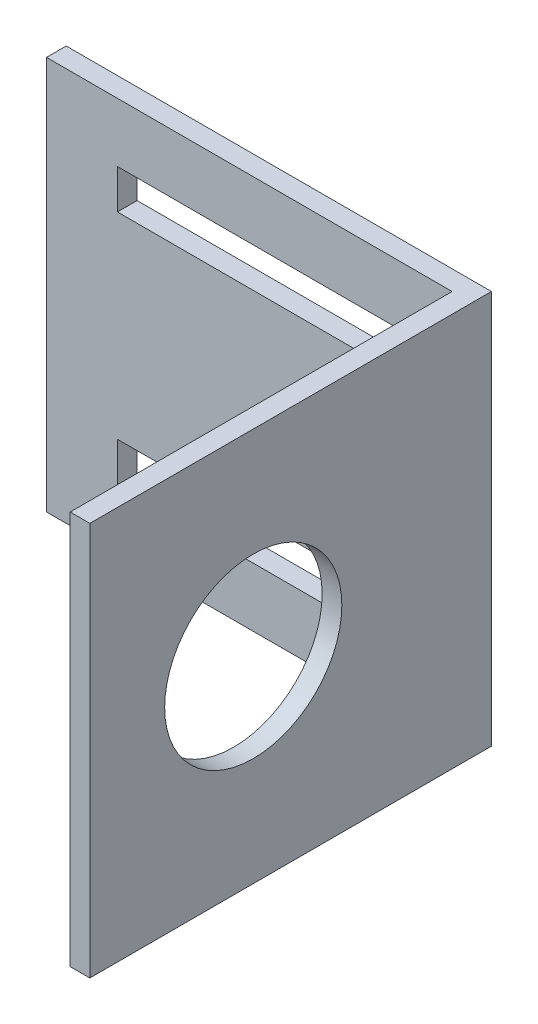
ISO-10303-21;
HEADER;
FILE_DESCRIPTION(('STEP AP214'),'2;1');
FILE_NAME('part.step','',(''),(''),'','','');
FILE_SCHEMA(('AUTOMOTIVE_DESIGN { 1 0 10303 214 1 1 1 1 }'));
ENDSEC;
DATA;
#1=APPLICATION_CONTEXT('core data for automotive mechanical design processes');
#2=APPLICATION_PROTOCOL_DEFINITION('international standard','automotive_design',2000,#1);
#3=PRODUCT_CONTEXT('',#1,'mechanical');
#4=PRODUCT('Part','Part','',(#3));
#5=PRODUCT_RELATED_PRODUCT_CATEGORY('part','',(#4));
#6=PRODUCT_DEFINITION_FORMATION('','',#4);
#7=PRODUCT_DEFINITION_CONTEXT('part definition',#1,'design');
#8=PRODUCT_DEFINITION('design','',#6,#7);
#9=PRODUCT_DEFINITION_SHAPE('','',#8);
#10=(LENGTH_UNIT() NAMED_UNIT(*) SI_UNIT(.MILLI.,.METRE.));
#11=(NAMED_UNIT(*) PLANE_ANGLE_UNIT() SI_UNIT($,.RADIAN.));
#12=(NAMED_UNIT(*) SI_UNIT($,.STERADIAN.) SOLID_ANGLE_UNIT());
#13=UNCERTAINTY_MEASURE_WITH_UNIT(LENGTH_MEASURE(1.E-05),#10,'distance_accuracy_value','');
#14=(GEOMETRIC_REPRESENTATION_CONTEXT(3) GLOBAL_UNCERTAINTY_ASSIGNED_CONTEXT((#13)) GLOBAL_UNIT_ASSIGNED_CONTEXT((#10,
#11,#12)) REPRESENTATION_CONTEXT('',''));
#15=CARTESIAN_POINT('',(0.,0.,0.));
#16=DIRECTION('',(0.,0.,1.));
#17=DIRECTION('',(1.,0.,0.));
#18=AXIS2_PLACEMENT_3D('',#15,#16,#17);
#19=CARTESIAN_POINT('',(0.,0.,2.5));
#20=DIRECTION('',(0.,0.,-1.));
#21=DIRECTION('',(-1.,0.,0.));
#22=AXIS2_PLACEMENT_3D('',#19,#20,#21);
#23=PLANE('',#22);
#24=DIRECTION('',(1.,0.,0.));
#25=VECTOR('',#24,1.);
#26=CARTESIAN_POINT('',(0.,-17.5,2.5));
#27=LINE('',#26,#25);
#28=CARTESIAN_POINT('',(-18.,-17.5,2.5));
#29=VERTEX_POINT('',#28);
#30=CARTESIAN_POINT('',(17.,-17.5,2.5));
#31=VERTEX_POINT('',#30);
#32=EDGE_CURVE('E192',#29,#31,#27,.T.);
#33=ORIENTED_EDGE('',*,*,#32,.F.);
#34=DIRECTION('',(0.,-1.,0.));
#35=VECTOR('',#34,1.);
#36=CARTESIAN_POINT('',(-18.,0.,2.5));
#37=LINE('',#36,#35);
#38=CARTESIAN_POINT('',(-18.,-12.5,2.5));
#39=VERTEX_POINT('',#38);
#40=EDGE_CURVE('E144',#39,#29,#37,.T.);
#41=ORIENTED_EDGE('',*,*,#40,.F.);
#42=DIRECTION('',(-1.,0.,0.));
#43=VECTOR('',#42,1.);
#44=CARTESIAN_POINT('',(0.,-12.5,2.5));
#45=LINE('',#44,#43);
#46=CARTESIAN_POINT('',(17.,-12.5,2.5));
#47=VERTEX_POINT('',#46);
#48=EDGE_CURVE('E188',#47,#39,#45,.T.);
#49=ORIENTED_EDGE('',*,*,#48,.F.);
#50=DIRECTION('',(0.,1.,0.));
#51=VECTOR('',#50,1.);
#52=CARTESIAN_POINT('',(17.,0.,2.5));
#53=LINE('',#52,#51);
#54=EDGE_CURVE('E190',#31,#47,#53,.T.);
#55=ORIENTED_EDGE('',*,*,#54,.F.);
#56=EDGE_LOOP('',(#33,#41,#49,#55));
#57=FACE_BOUND('',#56,.T.);
#58=DIRECTION('',(0.,-1.,0.));
#59=VECTOR('',#58,1.);
#60=CARTESIAN_POINT('',(24.5,0.,2.5));
#61=LINE('',#60,#59);
#62=CARTESIAN_POINT('',(24.5,25.,2.5));
#63=VERTEX_POINT('',#62);
#64=CARTESIAN_POINT('',(24.5,-25.,2.5));
#65=VERTEX_POINT('',#64);
#66=EDGE_CURVE('E220',#63,#65,#61,.T.);
#67=ORIENTED_EDGE('',*,*,#66,.F.);
#68=DIRECTION('',(-1.,0.,0.));
#69=VECTOR('',#68,1.);
#70=CARTESIAN_POINT('',(-27.,25.,2.5));
#71=LINE('',#70,#69);
#72=CARTESIAN_POINT('',(-27.,25.,2.5));
#73=VERTEX_POINT('',#72);
#74=EDGE_CURVE('E224',#63,#73,#71,.T.);
#75=ORIENTED_EDGE('',*,*,#74,.T.);
#76=DIRECTION('',(0.,-1.,0.));
#77=VECTOR('',#76,1.);
#78=CARTESIAN_POINT('',(-27.,-25.,2.5));
#79=LINE('',#78,#77);
#80=CARTESIAN_POINT('',(-27.,-25.,2.5));
#81=VERTEX_POINT('',#80);
#82=EDGE_CURVE('E226',#73,#81,#79,.T.);
#83=ORIENTED_EDGE('',*,*,#82,.T.);
#84=DIRECTION('',(1.,0.,0.));
#85=VECTOR('',#84,1.);
#86=CARTESIAN_POINT('',(-27.,-25.,2.5));
#87=LINE('',#86,#85);
#88=EDGE_CURVE('E229',#81,#65,#87,.T.);
#89=ORIENTED_EDGE('',*,*,#88,.T.);
#90=EDGE_LOOP('',(#67,#75,#83,#89));
#91=FACE_BOUND('',#90,.T.);
#92=DIRECTION('',(0.,-1.,0.));
#93=VECTOR('',#92,1.);
#94=CARTESIAN_POINT('',(-18.,0.,2.5));
#95=LINE('',#94,#93);
#96=CARTESIAN_POINT('',(-18.,17.5,2.5));
#97=VERTEX_POINT('',#96);
#98=CARTESIAN_POINT('',(-18.,12.5,2.5));
#99=VERTEX_POINT('',#98);
#100=EDGE_CURVE('E141',#97,#99,#95,.T.);
#101=ORIENTED_EDGE('',*,*,#100,.F.);
#102=DIRECTION('',(-1.,0.,0.));
#103=VECTOR('',#102,1.);
#104=CARTESIAN_POINT('',(0.,17.5,2.5));
#105=LINE('',#104,#103);
#106=CARTESIAN_POINT('',(17.,17.5,2.5));
#107=VERTEX_POINT('',#106);
#108=EDGE_CURVE('E194',#107,#97,#105,.T.);
#109=ORIENTED_EDGE('',*,*,#108,.F.);
#110=DIRECTION('',(0.,1.,0.));
#111=VECTOR('',#110,1.);
#112=CARTESIAN_POINT('',(17.,0.,2.5));
#113=LINE('',#112,#111);
#114=CARTESIAN_POINT('',(17.,12.5,2.5));
#115=VERTEX_POINT('',#114);
#116=EDGE_CURVE('E196',#115,#107,#113,.T.);
#117=ORIENTED_EDGE('',*,*,#116,.F.);
#118=DIRECTION('',(1.,0.,0.));
#119=VECTOR('',#118,1.);
#120=CARTESIAN_POINT('',(0.,12.5,2.5));
#121=LINE('',#120,#119);
#122=EDGE_CURVE('E198',#99,#115,#121,.T.);
#123=ORIENTED_EDGE('',*,*,#122,.F.);
#124=EDGE_LOOP('',(#101,#109,#117,#123));
#125=FACE_BOUND('',#124,.T.);
#126=ADVANCED_FACE('F32',(#57,#91,#125),#23,.F.);
#127=CARTESIAN_POINT('',(0.,0.,0.));
#128=DIRECTION('',(0.,0.,-1.));
#129=DIRECTION('',(-1.,0.,0.));
#130=AXIS2_PLACEMENT_3D('',#127,#128,#129);
#131=PLANE('',#130);
#132=DIRECTION('',(0.,1.,0.));
#133=VECTOR('',#132,1.);
#134=CARTESIAN_POINT('',(27.,-25.,0.));
#135=LINE('',#134,#133);
#136=CARTESIAN_POINT('',(27.,-25.,0.));
#137=VERTEX_POINT('',#136);
#138=CARTESIAN_POINT('',(27.,25.,0.));
#139=VERTEX_POINT('',#138);
#140=EDGE_CURVE('E223',#137,#139,#135,.T.);
#141=ORIENTED_EDGE('',*,*,#140,.F.);
#142=DIRECTION('',(1.,0.,0.));
#143=VECTOR('',#142,1.);
#144=CARTESIAN_POINT('',(-27.,-25.,0.));
#145=LINE('',#144,#143);
#146=CARTESIAN_POINT('',(-27.,-25.,0.));
#147=VERTEX_POINT('',#146);
#148=EDGE_CURVE('E227',#147,#137,#145,.T.);
#149=ORIENTED_EDGE('',*,*,#148,.F.);
#150=DIRECTION('',(0.,-1.,0.));
#151=VECTOR('',#150,1.);
#152=CARTESIAN_POINT('',(-27.,-25.,0.));
#153=LINE('',#152,#151);
#154=CARTESIAN_POINT('',(-27.,25.,0.));
#155=VERTEX_POINT('',#154);
#156=EDGE_CURVE('E236',#155,#147,#153,.T.);
#157=ORIENTED_EDGE('',*,*,#156,.F.);
#158=DIRECTION('',(-1.,0.,0.));
#159=VECTOR('',#158,1.);
#160=CARTESIAN_POINT('',(-27.,25.,0.));
#161=LINE('',#160,#159);
#162=EDGE_CURVE('E234',#139,#155,#161,.T.);
#163=ORIENTED_EDGE('',*,*,#162,.F.);
#164=EDGE_LOOP('',(#141,#149,#157,#163));
#165=FACE_BOUND('',#164,.T.);
#166=DIRECTION('',(0.,-1.,0.));
#167=VECTOR('',#166,1.);
#168=CARTESIAN_POINT('',(-18.,-17.5,0.));
#169=LINE('',#168,#167);
#170=CARTESIAN_POINT('',(-18.,-12.5,0.));
#171=VERTEX_POINT('',#170);
#172=CARTESIAN_POINT('',(-18.,-17.5,0.));
#173=VERTEX_POINT('',#172);
#174=EDGE_CURVE('E179',#171,#173,#169,.T.);
#175=ORIENTED_EDGE('',*,*,#174,.T.);
#176=DIRECTION('',(1.,0.,0.));
#177=VECTOR('',#176,1.);
#178=CARTESIAN_POINT('',(-18.,-17.5,0.));
#179=LINE('',#178,#177);
#180=CARTESIAN_POINT('',(17.,-17.5,0.));
#181=VERTEX_POINT('',#180);
#182=EDGE_CURVE('E170',#173,#181,#179,.T.);
#183=ORIENTED_EDGE('',*,*,#182,.T.);
#184=DIRECTION('',(0.,1.,0.));
#185=VECTOR('',#184,1.);
#186=CARTESIAN_POINT('',(17.,-17.5,0.));
#187=LINE('',#186,#185);
#188=CARTESIAN_POINT('',(17.,-12.5,0.));
#189=VERTEX_POINT('',#188);
#190=EDGE_CURVE('E173',#181,#189,#187,.T.);
#191=ORIENTED_EDGE('',*,*,#190,.T.);
#192=DIRECTION('',(-1.,0.,0.));
#193=VECTOR('',#192,1.);
#194=CARTESIAN_POINT('',(-18.,-12.5,0.));
#195=LINE('',#194,#193);
#196=EDGE_CURVE('E176',#189,#171,#195,.T.);
#197=ORIENTED_EDGE('',*,*,#196,.T.);
#198=EDGE_LOOP('',(#175,#183,#191,#197));
#199=FACE_BOUND('',#198,.T.);
#200=DIRECTION('',(-1.,0.,0.));
#201=VECTOR('',#200,1.);
#202=CARTESIAN_POINT('',(-18.,17.5,0.));
#203=LINE('',#202,#201);
#204=CARTESIAN_POINT('',(17.,17.5,0.));
#205=VERTEX_POINT('',#204);
#206=CARTESIAN_POINT('',(-18.,17.5,0.));
#207=VERTEX_POINT('',#206);
#208=EDGE_CURVE('E158',#205,#207,#203,.T.);
#209=ORIENTED_EDGE('',*,*,#208,.T.);
#210=DIRECTION('',(0.,-1.,0.));
#211=VECTOR('',#210,1.);
#212=CARTESIAN_POINT('',(-18.,17.5,0.));
#213=LINE('',#212,#211);
#214=CARTESIAN_POINT('',(-18.,12.5,0.));
#215=VERTEX_POINT('',#214);
#216=EDGE_CURVE('E138',#207,#215,#213,.T.);
#217=ORIENTED_EDGE('',*,*,#216,.T.);
#218=DIRECTION('',(1.,0.,0.));
#219=VECTOR('',#218,1.);
#220=CARTESIAN_POINT('',(-18.,12.5,0.));
#221=LINE('',#220,#219);
#222=CARTESIAN_POINT('',(17.,12.5,0.));
#223=VERTEX_POINT('',#222);
#224=EDGE_CURVE('E148',#215,#223,#221,.T.);
#225=ORIENTED_EDGE('',*,*,#224,.T.);
#226=DIRECTION('',(0.,1.,0.));
#227=VECTOR('',#226,1.);
#228=CARTESIAN_POINT('',(17.,17.5,0.));
#229=LINE('',#228,#227);
#230=EDGE_CURVE('E154',#223,#205,#229,.T.);
#231=ORIENTED_EDGE('',*,*,#230,.T.);
#232=EDGE_LOOP('',(#209,#217,#225,#231));
#233=FACE_BOUND('',#232,.T.);
#234=ADVANCED_FACE('F157',(#165,#199,#233),#131,.T.);
#235=CARTESIAN_POINT('',(27.,-25.,2.5));
#236=DIRECTION('',(-1.,0.,0.));
#237=DIRECTION('',(0.,0.,1.));
#238=AXIS2_PLACEMENT_3D('',#235,#236,#237);
#239=PLANE('',#238);
#240=CARTESIAN_POINT('',(27.,0.,30.25));
#241=DIRECTION('',(-1.,0.,0.));
#242=DIRECTION('',(0.,0.,1.));
#243=AXIS2_PLACEMENT_3D('',#240,#241,#242);
#244=CIRCLE('',#243,11.25);
#245=CARTESIAN_POINT('',(27.,0.,41.5));
#246=VERTEX_POINT('',#245);
#247=EDGE_CURVE('E201',#246,#246,#244,.F.);
#248=ORIENTED_EDGE('',*,*,#247,.F.);
#249=EDGE_LOOP('',(#248));
#250=FACE_BOUND('',#249,.T.);
#251=ORIENTED_EDGE('',*,*,#140,.T.);
#252=DIRECTION('',(0.,0.,-1.));
#253=VECTOR('',#252,1.);
#254=CARTESIAN_POINT('',(27.,25.,2.5));
#255=LINE('',#254,#253);
#256=CARTESIAN_POINT('',(27.,25.,51.));
#257=VERTEX_POINT('',#256);
#258=EDGE_CURVE('E11',#257,#139,#255,.T.);
#259=ORIENTED_EDGE('',*,*,#258,.F.);
#260=DIRECTION('',(0.,1.,0.));
#261=VECTOR('',#260,1.);
#262=CARTESIAN_POINT('',(27.,25.,51.));
#263=LINE('',#262,#261);
#264=CARTESIAN_POINT('',(27.,-25.,51.));
#265=VERTEX_POINT('',#264);
#266=EDGE_CURVE('E204',#265,#257,#263,.T.);
#267=ORIENTED_EDGE('',*,*,#266,.F.);
#268=DIRECTION('',(0.,0.,-1.));
#269=VECTOR('',#268,1.);
#270=CARTESIAN_POINT('',(27.,-25.,2.5));
#271=LINE('',#270,#269);
#272=EDGE_CURVE('E231',#265,#137,#271,.T.);
#273=ORIENTED_EDGE('',*,*,#272,.T.);
#274=EDGE_LOOP('',(#251,#259,#267,#273));
#275=FACE_BOUND('',#274,.T.);
#276=ADVANCED_FACE('F34',(#250,#275),#239,.F.);
#277=CARTESIAN_POINT('',(-27.,25.,2.5));
#278=DIRECTION('',(0.,-1.,0.));
#279=DIRECTION('',(0.,0.,-1.));
#280=AXIS2_PLACEMENT_3D('',#277,#278,#279);
#281=PLANE('',#280);
#282=ORIENTED_EDGE('',*,*,#162,.T.);
#283=DIRECTION('',(0.,0.,-1.));
#284=VECTOR('',#283,1.);
#285=CARTESIAN_POINT('',(-27.,25.,2.5));
#286=LINE('',#285,#284);
#287=EDGE_CURVE('E41',#73,#155,#286,.T.);
#288=ORIENTED_EDGE('',*,*,#287,.F.);
#289=ORIENTED_EDGE('',*,*,#74,.F.);
#290=DIRECTION('',(0.,0.,-1.));
#291=VECTOR('',#290,1.);
#292=CARTESIAN_POINT('',(24.5,25.,51.));
#293=LINE('',#292,#291);
#294=CARTESIAN_POINT('',(24.5,25.,51.));
#295=VERTEX_POINT('',#294);
#296=EDGE_CURVE('E217',#295,#63,#293,.T.);
#297=ORIENTED_EDGE('',*,*,#296,.F.);
#298=DIRECTION('',(-1.,0.,0.));
#299=VECTOR('',#298,1.);
#300=CARTESIAN_POINT('',(27.,25.,51.));
#301=LINE('',#300,#299);
#302=EDGE_CURVE('E207',#257,#295,#301,.T.);
#303=ORIENTED_EDGE('',*,*,#302,.F.);
#304=ORIENTED_EDGE('',*,*,#258,.T.);
#305=EDGE_LOOP('',(#282,#288,#289,#297,#303,#304));
#306=FACE_BOUND('',#305,.T.);
#307=ADVANCED_FACE('F273',(#306),#281,.F.);
#308=CARTESIAN_POINT('',(-27.,-25.,2.5));
#309=DIRECTION('',(1.,0.,0.));
#310=DIRECTION('',(0.,0.,-1.));
#311=AXIS2_PLACEMENT_3D('',#308,#309,#310);
#312=PLANE('',#311);
#313=ORIENTED_EDGE('',*,*,#156,.T.);
#314=DIRECTION('',(0.,0.,-1.));
#315=VECTOR('',#314,1.);
#316=CARTESIAN_POINT('',(-27.,-25.,2.5));
#317=LINE('',#316,#315);
#318=EDGE_CURVE('E241',#81,#147,#317,.T.);
#319=ORIENTED_EDGE('',*,*,#318,.F.);
#320=ORIENTED_EDGE('',*,*,#82,.F.);
#321=ORIENTED_EDGE('',*,*,#287,.T.);
#322=EDGE_LOOP('',(#313,#319,#320,#321));
#323=FACE_BOUND('',#322,.T.);
#324=ADVANCED_FACE('F249',(#323),#312,.F.);
#325=CARTESIAN_POINT('',(-27.,-25.,2.5));
#326=DIRECTION('',(0.,1.,0.));
#327=DIRECTION('',(0.,0.,1.));
#328=AXIS2_PLACEMENT_3D('',#325,#326,#327);
#329=PLANE('',#328);
#330=ORIENTED_EDGE('',*,*,#272,.F.);
#331=DIRECTION('',(1.,0.,0.));
#332=VECTOR('',#331,1.);
#333=CARTESIAN_POINT('',(27.,-25.,51.));
#334=LINE('',#333,#332);
#335=CARTESIAN_POINT('',(24.5,-25.,51.));
#336=VERTEX_POINT('',#335);
#337=EDGE_CURVE('E211',#336,#265,#334,.T.);
#338=ORIENTED_EDGE('',*,*,#337,.F.);
#339=DIRECTION('',(0.,0.,-1.));
#340=VECTOR('',#339,1.);
#341=CARTESIAN_POINT('',(24.5,-25.,51.));
#342=LINE('',#341,#340);
#343=EDGE_CURVE('E214',#336,#65,#342,.T.);
#344=ORIENTED_EDGE('',*,*,#343,.T.);
#345=ORIENTED_EDGE('',*,*,#88,.F.);
#346=ORIENTED_EDGE('',*,*,#318,.T.);
#347=ORIENTED_EDGE('',*,*,#148,.T.);
#348=EDGE_LOOP('',(#330,#338,#344,#345,#346,#347));
#349=FACE_BOUND('',#348,.T.);
#350=ADVANCED_FACE('F258',(#349),#329,.F.);
#351=CARTESIAN_POINT('',(24.5,25.,51.));
#352=DIRECTION('',(1.,0.,0.));
#353=DIRECTION('',(0.,1.,0.));
#354=AXIS2_PLACEMENT_3D('',#351,#352,#353);
#355=PLANE('',#354);
#356=CARTESIAN_POINT('',(24.5,0.,30.25));
#357=DIRECTION('',(1.,0.,0.));
#358=DIRECTION('',(0.,1.,0.));
#359=AXIS2_PLACEMENT_3D('',#356,#357,#358);
#360=CIRCLE('',#359,11.25);
#361=CARTESIAN_POINT('',(24.5,11.25,30.25));
#362=VERTEX_POINT('',#361);
#363=EDGE_CURVE('E36',#362,#362,#360,.F.);
#364=ORIENTED_EDGE('',*,*,#363,.F.);
#365=EDGE_LOOP('',(#364));
#366=FACE_BOUND('',#365,.T.);
#367=ORIENTED_EDGE('',*,*,#296,.T.);
#368=ORIENTED_EDGE('',*,*,#66,.T.);
#369=ORIENTED_EDGE('',*,*,#343,.F.);
#370=DIRECTION('',(0.,-1.,0.));
#371=VECTOR('',#370,1.);
#372=CARTESIAN_POINT('',(24.5,25.,51.));
#373=LINE('',#372,#371);
#374=EDGE_CURVE('E209',#295,#336,#373,.T.);
#375=ORIENTED_EDGE('',*,*,#374,.F.);
#376=EDGE_LOOP('',(#367,#368,#369,#375));
#377=FACE_BOUND('',#376,.T.);
#378=ADVANCED_FACE('F270',(#366,#377),#355,.F.);
#379=CARTESIAN_POINT('',(0.,0.,51.));
#380=DIRECTION('',(0.,0.,-1.));
#381=DIRECTION('',(-1.,0.,0.));
#382=AXIS2_PLACEMENT_3D('',#379,#380,#381);
#383=PLANE('',#382);
#384=ORIENTED_EDGE('',*,*,#266,.T.);
#385=ORIENTED_EDGE('',*,*,#302,.T.);
#386=ORIENTED_EDGE('',*,*,#374,.T.);
#387=ORIENTED_EDGE('',*,*,#337,.T.);
#388=EDGE_LOOP('',(#384,#385,#386,#387));
#389=FACE_BOUND('',#388,.T.);
#390=ADVANCED_FACE('F265',(#389),#383,.F.);
#391=CARTESIAN_POINT('',(51.,0.,30.25));
#392=DIRECTION('',(-1.,0.,0.));
#393=DIRECTION('',(0.,0.,1.));
#394=AXIS2_PLACEMENT_3D('',#391,#392,#393);
#395=CYLINDRICAL_SURFACE('',#394,11.25);
#396=ORIENTED_EDGE('',*,*,#363,.T.);
#397=EDGE_LOOP('',(#396));
#398=FACE_BOUND('',#397,.T.);
#399=ORIENTED_EDGE('',*,*,#247,.T.);
#400=EDGE_LOOP('',(#399));
#401=FACE_BOUND('',#400,.T.);
#402=ADVANCED_FACE('F300',(#398,#401),#395,.F.);
#403=CARTESIAN_POINT('',(-18.,-17.5,51.));
#404=DIRECTION('',(0.,1.,0.));
#405=DIRECTION('',(0.,0.,1.));
#406=AXIS2_PLACEMENT_3D('',#403,#404,#405);
#407=PLANE('',#406);
#408=ORIENTED_EDGE('',*,*,#32,.T.);
#409=DIRECTION('',(0.,0.,-1.));
#410=VECTOR('',#409,1.);
#411=CARTESIAN_POINT('',(17.,-17.5,51.));
#412=LINE('',#411,#410);
#413=EDGE_CURVE('E159',#31,#181,#412,.T.);
#414=ORIENTED_EDGE('',*,*,#413,.T.);
#415=ORIENTED_EDGE('',*,*,#182,.F.);
#416=DIRECTION('',(0.,0.,-1.));
#417=VECTOR('',#416,1.);
#418=CARTESIAN_POINT('',(-18.,-17.5,51.));
#419=LINE('',#418,#417);
#420=EDGE_CURVE('E182',#29,#173,#419,.T.);
#421=ORIENTED_EDGE('',*,*,#420,.F.);
#422=EDGE_LOOP('',(#408,#414,#415,#421));
#423=FACE_BOUND('',#422,.T.);
#424=ADVANCED_FACE('F306',(#423),#407,.T.);
#425=CARTESIAN_POINT('',(17.,-17.5,51.));
#426=DIRECTION('',(-1.,0.,0.));
#427=DIRECTION('',(0.,0.,1.));
#428=AXIS2_PLACEMENT_3D('',#425,#426,#427);
#429=PLANE('',#428);
#430=ORIENTED_EDGE('',*,*,#54,.T.);
#431=DIRECTION('',(0.,0.,-1.));
#432=VECTOR('',#431,1.);
#433=CARTESIAN_POINT('',(17.,-12.5,51.));
#434=LINE('',#433,#432);
#435=EDGE_CURVE('E161',#47,#189,#434,.T.);
#436=ORIENTED_EDGE('',*,*,#435,.T.);
#437=ORIENTED_EDGE('',*,*,#190,.F.);
#438=ORIENTED_EDGE('',*,*,#413,.F.);
#439=EDGE_LOOP('',(#430,#436,#437,#438));
#440=FACE_BOUND('',#439,.T.);
#441=ADVANCED_FACE('F312',(#440),#429,.T.);
#442=CARTESIAN_POINT('',(-18.,-12.5,51.));
#443=DIRECTION('',(0.,-1.,0.));
#444=DIRECTION('',(0.,0.,-1.));
#445=AXIS2_PLACEMENT_3D('',#442,#443,#444);
#446=PLANE('',#445);
#447=ORIENTED_EDGE('',*,*,#48,.T.);
#448=DIRECTION('',(0.,0.,-1.));
#449=VECTOR('',#448,1.);
#450=CARTESIAN_POINT('',(-18.,-12.5,51.));
#451=LINE('',#450,#449);
#452=EDGE_CURVE('E56',#39,#171,#451,.T.);
#453=ORIENTED_EDGE('',*,*,#452,.T.);
#454=ORIENTED_EDGE('',*,*,#196,.F.);
#455=ORIENTED_EDGE('',*,*,#435,.F.);
#456=EDGE_LOOP('',(#447,#453,#454,#455));
#457=FACE_BOUND('',#456,.T.);
#458=ADVANCED_FACE('F318',(#457),#446,.T.);
#459=CARTESIAN_POINT('',(-18.,-17.5,51.));
#460=DIRECTION('',(1.,0.,0.));
#461=DIRECTION('',(0.,0.,-1.));
#462=AXIS2_PLACEMENT_3D('',#459,#460,#461);
#463=PLANE('',#462);
#464=ORIENTED_EDGE('',*,*,#40,.T.);
#465=ORIENTED_EDGE('',*,*,#420,.T.);
#466=ORIENTED_EDGE('',*,*,#174,.F.);
#467=ORIENTED_EDGE('',*,*,#452,.F.);
#468=EDGE_LOOP('',(#464,#465,#466,#467));
#469=FACE_BOUND('',#468,.T.);
#470=ADVANCED_FACE('F322',(#469),#463,.T.);
#471=CARTESIAN_POINT('',(-18.,17.5,51.));
#472=DIRECTION('',(1.,0.,0.));
#473=DIRECTION('',(0.,0.,-1.));
#474=AXIS2_PLACEMENT_3D('',#471,#472,#473);
#475=PLANE('',#474);
#476=ORIENTED_EDGE('',*,*,#100,.T.);
#477=DIRECTION('',(0.,0.,-1.));
#478=VECTOR('',#477,1.);
#479=CARTESIAN_POINT('',(-18.,12.5,51.));
#480=LINE('',#479,#478);
#481=EDGE_CURVE('E133',#99,#215,#480,.T.);
#482=ORIENTED_EDGE('',*,*,#481,.T.);
#483=ORIENTED_EDGE('',*,*,#216,.F.);
#484=DIRECTION('',(0.,0.,-1.));
#485=VECTOR('',#484,1.);
#486=CARTESIAN_POINT('',(-18.,17.5,51.));
#487=LINE('',#486,#485);
#488=EDGE_CURVE('E166',#97,#207,#487,.T.);
#489=ORIENTED_EDGE('',*,*,#488,.F.);
#490=EDGE_LOOP('',(#476,#482,#483,#489));
#491=FACE_BOUND('',#490,.T.);
#492=ADVANCED_FACE('F135',(#491),#475,.T.);
#493=CARTESIAN_POINT('',(-18.,12.5,51.));
#494=DIRECTION('',(0.,1.,0.));
#495=DIRECTION('',(0.,0.,1.));
#496=AXIS2_PLACEMENT_3D('',#493,#494,#495);
#497=PLANE('',#496);
#498=ORIENTED_EDGE('',*,*,#122,.T.);
#499=DIRECTION('',(0.,0.,-1.));
#500=VECTOR('',#499,1.);
#501=CARTESIAN_POINT('',(17.,12.5,51.));
#502=LINE('',#501,#500);
#503=EDGE_CURVE('E145',#115,#223,#502,.T.);
#504=ORIENTED_EDGE('',*,*,#503,.T.);
#505=ORIENTED_EDGE('',*,*,#224,.F.);
#506=ORIENTED_EDGE('',*,*,#481,.F.);
#507=EDGE_LOOP('',(#498,#504,#505,#506));
#508=FACE_BOUND('',#507,.T.);
#509=ADVANCED_FACE('F149',(#508),#497,.T.);
#510=CARTESIAN_POINT('',(17.,17.5,51.));
#511=DIRECTION('',(-1.,0.,0.));
#512=DIRECTION('',(0.,0.,1.));
#513=AXIS2_PLACEMENT_3D('',#510,#511,#512);
#514=PLANE('',#513);
#515=ORIENTED_EDGE('',*,*,#116,.T.);
#516=DIRECTION('',(0.,0.,-1.));
#517=VECTOR('',#516,1.);
#518=CARTESIAN_POINT('',(17.,17.5,51.));
#519=LINE('',#518,#517);
#520=EDGE_CURVE('E48',#107,#205,#519,.T.);
#521=ORIENTED_EDGE('',*,*,#520,.T.);
#522=ORIENTED_EDGE('',*,*,#230,.F.);
#523=ORIENTED_EDGE('',*,*,#503,.F.);
#524=EDGE_LOOP('',(#515,#521,#522,#523));
#525=FACE_BOUND('',#524,.T.);
#526=ADVANCED_FACE('F330',(#525),#514,.T.);
#527=CARTESIAN_POINT('',(-18.,17.5,51.));
#528=DIRECTION('',(0.,-1.,0.));
#529=DIRECTION('',(0.,0.,-1.));
#530=AXIS2_PLACEMENT_3D('',#527,#528,#529);
#531=PLANE('',#530);
#532=ORIENTED_EDGE('',*,*,#108,.T.);
#533=ORIENTED_EDGE('',*,*,#488,.T.);
#534=ORIENTED_EDGE('',*,*,#208,.F.);
#535=ORIENTED_EDGE('',*,*,#520,.F.);
#536=EDGE_LOOP('',(#532,#533,#534,#535));
#537=FACE_BOUND('',#536,.T.);
#538=ADVANCED_FACE('F333',(#537),#531,.T.);
#539=CLOSED_SHELL('',(#126,#234,#276,#307,#324,#350,#378,#390,#402,#424,#441,#458,#470,#492,
#509,#526,#538));
#540=MANIFOLD_SOLID_BREP('B2',#539);
#541=ADVANCED_BREP_SHAPE_REPRESENTATION('',(#18,#540),#14);
#542=SHAPE_DEFINITION_REPRESENTATION(#9,#541);
ENDSEC;
END-ISO-10303-21;
